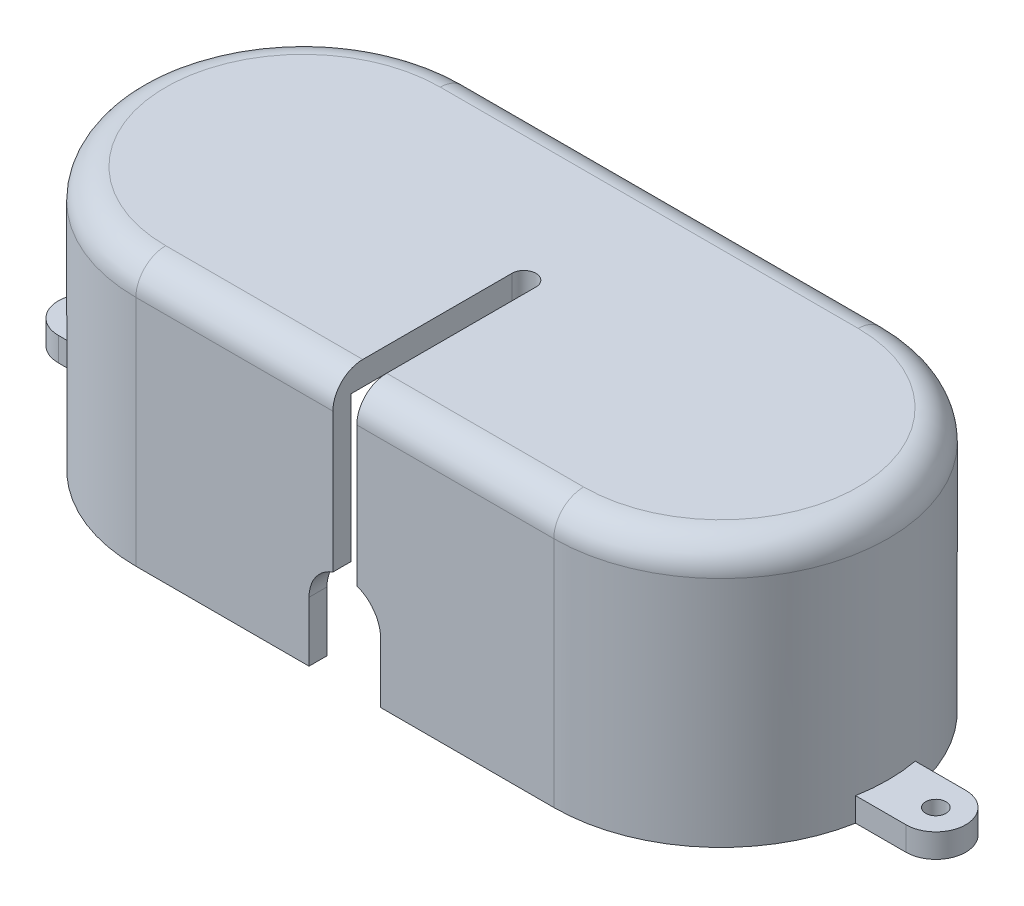
ISO-10303-21;
HEADER;
FILE_DESCRIPTION(('STEP AP214'),'2;1');
FILE_NAME('part.step','',(''),(''),'','','');
FILE_SCHEMA(('AUTOMOTIVE_DESIGN { 1 0 10303 214 1 1 1 1 }'));
ENDSEC;
DATA;
#1=APPLICATION_CONTEXT('core data for automotive mechanical design processes');
#2=APPLICATION_PROTOCOL_DEFINITION('international standard','automotive_design',2000,#1);
#3=PRODUCT_CONTEXT('',#1,'mechanical');
#4=PRODUCT('Part','Part','',(#3));
#5=PRODUCT_RELATED_PRODUCT_CATEGORY('part','',(#4));
#6=PRODUCT_DEFINITION_FORMATION('','',#4);
#7=PRODUCT_DEFINITION_CONTEXT('part definition',#1,'design');
#8=PRODUCT_DEFINITION('design','',#6,#7);
#9=PRODUCT_DEFINITION_SHAPE('','',#8);
#10=(LENGTH_UNIT() NAMED_UNIT(*) SI_UNIT(.MILLI.,.METRE.));
#11=(NAMED_UNIT(*) PLANE_ANGLE_UNIT() SI_UNIT($,.RADIAN.));
#12=(NAMED_UNIT(*) SI_UNIT($,.STERADIAN.) SOLID_ANGLE_UNIT());
#13=UNCERTAINTY_MEASURE_WITH_UNIT(LENGTH_MEASURE(1.E-05),#10,'distance_accuracy_value','');
#14=(GEOMETRIC_REPRESENTATION_CONTEXT(3) GLOBAL_UNCERTAINTY_ASSIGNED_CONTEXT((#13)) GLOBAL_UNIT_ASSIGNED_CONTEXT((#10,
#11,#12)) REPRESENTATION_CONTEXT('',''));
#15=CARTESIAN_POINT('',(0.,0.,0.));
#16=DIRECTION('',(0.,0.,1.));
#17=DIRECTION('',(1.,0.,0.));
#18=AXIS2_PLACEMENT_3D('',#15,#16,#17);
#19=CARTESIAN_POINT('',(-35.,40.,28.));
#20=DIRECTION('',(0.,0.,-1.));
#21=DIRECTION('',(-1.,0.,0.));
#22=AXIS2_PLACEMENT_3D('',#19,#20,#21);
#23=PLANE('',#22);
#24=DIRECTION('',(0.,1.,0.));
#25=VECTOR('',#24,1.);
#26=CARTESIAN_POINT('',(-1.99999999999999,0.,28.));
#27=LINE('',#26,#25);
#28=CARTESIAN_POINT('',(-2.,15.6568542494924,28.));
#29=VERTEX_POINT('',#28);
#30=CARTESIAN_POINT('',(-2.00000000000001,39.,28.));
#31=VERTEX_POINT('',#30);
#32=EDGE_CURVE('E253',#29,#31,#27,.T.);
#33=ORIENTED_EDGE('',*,*,#32,.T.);
#34=DIRECTION('',(-1.,0.,0.));
#35=VECTOR('',#34,1.);
#36=CARTESIAN_POINT('',(-35.,39.,28.));
#37=LINE('',#36,#35);
#38=CARTESIAN_POINT('',(-35.,39.,28.));
#39=VERTEX_POINT('',#38);
#40=EDGE_CURVE('E515',#31,#39,#37,.T.);
#41=ORIENTED_EDGE('',*,*,#40,.T.);
#42=DIRECTION('',(0.,-1.,0.));
#43=VECTOR('',#42,1.);
#44=CARTESIAN_POINT('',(-35.,40.,28.));
#45=LINE('',#44,#43);
#46=CARTESIAN_POINT('',(-35.,0.,28.));
#47=VERTEX_POINT('',#46);
#48=EDGE_CURVE('E505',#39,#47,#45,.T.);
#49=ORIENTED_EDGE('',*,*,#48,.T.);
#50=DIRECTION('',(1.,0.,0.));
#51=VECTOR('',#50,1.);
#52=CARTESIAN_POINT('',(-35.,0.,28.));
#53=LINE('',#52,#51);
#54=CARTESIAN_POINT('',(-6.,0.,28.));
#55=VERTEX_POINT('',#54);
#56=EDGE_CURVE('E484',#47,#55,#53,.T.);
#57=ORIENTED_EDGE('',*,*,#56,.T.);
#58=DIRECTION('',(0.,1.,0.));
#59=VECTOR('',#58,1.);
#60=CARTESIAN_POINT('',(-5.99999999999998,40.,28.));
#61=LINE('',#60,#59);
#62=CARTESIAN_POINT('',(-5.99999999999999,10.,28.));
#63=VERTEX_POINT('',#62);
#64=EDGE_CURVE('E321',#55,#63,#61,.T.);
#65=ORIENTED_EDGE('',*,*,#64,.T.);
#66=CARTESIAN_POINT('',(0.,10.,28.));
#67=DIRECTION('',(0.,0.,-1.));
#68=DIRECTION('',(-1.,0.,0.));
#69=AXIS2_PLACEMENT_3D('',#66,#67,#68);
#70=CIRCLE('',#69,6.);
#71=EDGE_CURVE('E326',#63,#29,#70,.T.);
#72=ORIENTED_EDGE('',*,*,#71,.T.);
#73=EDGE_LOOP('',(#33,#41,#49,#57,#65,#72));
#74=FACE_BOUND('',#73,.T.);
#75=ADVANCED_FACE('F49',(#74),#23,.F.);
#76=CARTESIAN_POINT('',(-35.,40.,25.));
#77=DIRECTION('',(0.,0.,-1.));
#78=DIRECTION('',(-1.,0.,0.));
#79=AXIS2_PLACEMENT_3D('',#76,#77,#78);
#80=PLANE('',#79);
#81=DIRECTION('',(1.,0.,0.));
#82=VECTOR('',#81,1.);
#83=CARTESIAN_POINT('',(-35.,40.,25.));
#84=LINE('',#83,#82);
#85=CARTESIAN_POINT('',(-35.,40.,25.));
#86=VERTEX_POINT('',#85);
#87=CARTESIAN_POINT('',(-2.,40.,25.));
#88=VERTEX_POINT('',#87);
#89=EDGE_CURVE('E437',#86,#88,#84,.T.);
#90=ORIENTED_EDGE('',*,*,#89,.T.);
#91=DIRECTION('',(0.,-1.,0.));
#92=VECTOR('',#91,1.);
#93=CARTESIAN_POINT('',(-2.,40.,25.));
#94=LINE('',#93,#92);
#95=CARTESIAN_POINT('',(-2.,15.6568542494924,25.));
#96=VERTEX_POINT('',#95);
#97=EDGE_CURVE('E283',#88,#96,#94,.T.);
#98=ORIENTED_EDGE('',*,*,#97,.T.);
#99=CARTESIAN_POINT('',(0.,10.,25.));
#100=DIRECTION('',(0.,0.,-1.));
#101=DIRECTION('',(-1.,0.,0.));
#102=AXIS2_PLACEMENT_3D('',#99,#100,#101);
#103=CIRCLE('',#102,6.);
#104=CARTESIAN_POINT('',(-5.99999999999999,10.,25.));
#105=VERTEX_POINT('',#104);
#106=EDGE_CURVE('E292',#105,#96,#103,.T.);
#107=ORIENTED_EDGE('',*,*,#106,.F.);
#108=DIRECTION('',(0.,1.,0.));
#109=VECTOR('',#108,1.);
#110=CARTESIAN_POINT('',(-5.99999999999999,10.,25.));
#111=LINE('',#110,#109);
#112=CARTESIAN_POINT('',(-6.,0.,25.));
#113=VERTEX_POINT('',#112);
#114=EDGE_CURVE('E299',#113,#105,#111,.T.);
#115=ORIENTED_EDGE('',*,*,#114,.F.);
#116=DIRECTION('',(1.,0.,0.));
#117=VECTOR('',#116,1.);
#118=CARTESIAN_POINT('',(-35.,0.,25.));
#119=LINE('',#118,#117);
#120=CARTESIAN_POINT('',(-35.,0.,25.));
#121=VERTEX_POINT('',#120);
#122=EDGE_CURVE('E454',#121,#113,#119,.T.);
#123=ORIENTED_EDGE('',*,*,#122,.F.);
#124=DIRECTION('',(0.,-1.,0.));
#125=VECTOR('',#124,1.);
#126=CARTESIAN_POINT('',(-35.,40.,25.));
#127=LINE('',#126,#125);
#128=EDGE_CURVE('E475',#86,#121,#127,.T.);
#129=ORIENTED_EDGE('',*,*,#128,.F.);
#130=EDGE_LOOP('',(#90,#98,#107,#115,#123,#129));
#131=FACE_BOUND('',#130,.T.);
#132=ADVANCED_FACE('F589',(#131),#80,.T.);
#133=CARTESIAN_POINT('',(-35.,40.,0.));
#134=DIRECTION('',(0.,1.,0.));
#135=DIRECTION('',(0.,0.,1.));
#136=AXIS2_PLACEMENT_3D('',#133,#134,#135);
#137=PLANE('',#136);
#138=DIRECTION('',(0.,0.,-1.));
#139=VECTOR('',#138,1.);
#140=CARTESIAN_POINT('',(2.00000000000002,40.,0.));
#141=LINE('',#140,#139);
#142=CARTESIAN_POINT('',(2.00000000000002,40.,25.));
#143=VERTEX_POINT('',#142);
#144=CARTESIAN_POINT('',(2.00000000000001,40.,-2.));
#145=VERTEX_POINT('',#144);
#146=EDGE_CURVE('E280',#143,#145,#141,.T.);
#147=ORIENTED_EDGE('',*,*,#146,.T.);
#148=CARTESIAN_POINT('',(0.,40.,-2.));
#149=DIRECTION('',(0.,1.,0.));
#150=DIRECTION('',(0.,0.,1.));
#151=AXIS2_PLACEMENT_3D('',#148,#149,#150);
#152=CIRCLE('',#151,2.00000000000001);
#153=CARTESIAN_POINT('',(-2.00000000000001,40.,-2.));
#154=VERTEX_POINT('',#153);
#155=EDGE_CURVE('E247',#145,#154,#152,.T.);
#156=ORIENTED_EDGE('',*,*,#155,.T.);
#157=DIRECTION('',(0.,0.,-1.));
#158=VECTOR('',#157,1.);
#159=CARTESIAN_POINT('',(-2.,40.,0.));
#160=LINE('',#159,#158);
#161=EDGE_CURVE('E287',#88,#154,#160,.T.);
#162=ORIENTED_EDGE('',*,*,#161,.F.);
#163=ORIENTED_EDGE('',*,*,#89,.F.);
#164=CARTESIAN_POINT('',(-35.,40.,0.));
#165=DIRECTION('',(0.,1.,0.));
#166=DIRECTION('',(0.,0.,1.));
#167=AXIS2_PLACEMENT_3D('',#164,#165,#166);
#168=CIRCLE('',#167,25.);
#169=CARTESIAN_POINT('',(-35.,40.,-25.));
#170=VERTEX_POINT('',#169);
#171=EDGE_CURVE('E431',#170,#86,#168,.T.);
#172=ORIENTED_EDGE('',*,*,#171,.F.);
#173=DIRECTION('',(-1.,0.,0.));
#174=VECTOR('',#173,1.);
#175=CARTESIAN_POINT('',(-35.,40.,-25.));
#176=LINE('',#175,#174);
#177=CARTESIAN_POINT('',(35.,40.,-25.));
#178=VERTEX_POINT('',#177);
#179=EDGE_CURVE('E445',#178,#170,#176,.T.);
#180=ORIENTED_EDGE('',*,*,#179,.F.);
#181=CARTESIAN_POINT('',(35.,40.,0.));
#182=DIRECTION('',(0.,1.,0.));
#183=DIRECTION('',(0.,0.,1.));
#184=AXIS2_PLACEMENT_3D('',#181,#182,#183);
#185=CIRCLE('',#184,25.);
#186=CARTESIAN_POINT('',(35.,40.,25.));
#187=VERTEX_POINT('',#186);
#188=EDGE_CURVE('E441',#187,#178,#185,.T.);
#189=ORIENTED_EDGE('',*,*,#188,.F.);
#190=EDGE_CURVE('E435',#143,#187,#84,.T.);
#191=ORIENTED_EDGE('',*,*,#190,.F.);
#192=EDGE_LOOP('',(#147,#156,#162,#163,#172,#180,#189,#191));
#193=FACE_BOUND('',#192,.T.);
#194=ADVANCED_FACE('F582',(#193),#137,.F.);
#195=CARTESIAN_POINT('',(-35.,44.,0.));
#196=DIRECTION('',(0.,1.,0.));
#197=DIRECTION('',(0.,0.,1.));
#198=AXIS2_PLACEMENT_3D('',#195,#196,#197);
#199=PLANE('',#198);
#200=CARTESIAN_POINT('',(-35.,44.,0.));
#201=DIRECTION('',(0.,1.,0.));
#202=DIRECTION('',(0.,0.,1.));
#203=AXIS2_PLACEMENT_3D('',#200,#201,#202);
#204=CIRCLE('',#203,23.);
#205=CARTESIAN_POINT('',(-35.,44.,-23.));
#206=VERTEX_POINT('',#205);
#207=CARTESIAN_POINT('',(-35.,44.,23.));
#208=VERTEX_POINT('',#207);
#209=EDGE_CURVE('E525',#206,#208,#204,.T.);
#210=ORIENTED_EDGE('',*,*,#209,.T.);
#211=DIRECTION('',(-1.,0.,0.));
#212=VECTOR('',#211,1.);
#213=CARTESIAN_POINT('',(-2.00000000000001,44.,23.));
#214=LINE('',#213,#212);
#215=CARTESIAN_POINT('',(-2.00000000000001,44.,23.));
#216=VERTEX_POINT('',#215);
#217=EDGE_CURVE('E531',#208,#216,#214,.F.);
#218=ORIENTED_EDGE('',*,*,#217,.T.);
#219=DIRECTION('',(0.,0.,1.));
#220=VECTOR('',#219,1.);
#221=CARTESIAN_POINT('',(-2.00000000000001,44.,-2.));
#222=LINE('',#221,#220);
#223=CARTESIAN_POINT('',(-2.00000000000001,44.,-2.));
#224=VERTEX_POINT('',#223);
#225=EDGE_CURVE('E262',#224,#216,#222,.T.);
#226=ORIENTED_EDGE('',*,*,#225,.F.);
#227=CARTESIAN_POINT('',(0.,44.,-2.));
#228=DIRECTION('',(0.,1.,0.));
#229=DIRECTION('',(0.,0.,1.));
#230=AXIS2_PLACEMENT_3D('',#227,#228,#229);
#231=CIRCLE('',#230,2.00000000000001);
#232=CARTESIAN_POINT('',(2.00000000000001,44.,-2.));
#233=VERTEX_POINT('',#232);
#234=EDGE_CURVE('E244',#233,#224,#231,.T.);
#235=ORIENTED_EDGE('',*,*,#234,.F.);
#236=DIRECTION('',(0.,0.,1.));
#237=VECTOR('',#236,1.);
#238=CARTESIAN_POINT('',(2.00000000000001,44.,-2.));
#239=LINE('',#238,#237);
#240=CARTESIAN_POINT('',(2.00000000000001,44.,23.));
#241=VERTEX_POINT('',#240);
#242=EDGE_CURVE('E259',#233,#241,#239,.T.);
#243=ORIENTED_EDGE('',*,*,#242,.T.);
#244=DIRECTION('',(-1.,0.,0.));
#245=VECTOR('',#244,1.);
#246=CARTESIAN_POINT('',(35.,44.,23.));
#247=LINE('',#246,#245);
#248=CARTESIAN_POINT('',(35.,44.,23.));
#249=VERTEX_POINT('',#248);
#250=EDGE_CURVE('E528',#241,#249,#247,.F.);
#251=ORIENTED_EDGE('',*,*,#250,.T.);
#252=CARTESIAN_POINT('',(35.,44.,0.));
#253=DIRECTION('',(0.,1.,0.));
#254=DIRECTION('',(0.,0.,1.));
#255=AXIS2_PLACEMENT_3D('',#252,#253,#254);
#256=CIRCLE('',#255,23.);
#257=CARTESIAN_POINT('',(35.,44.,-23.));
#258=VERTEX_POINT('',#257);
#259=EDGE_CURVE('E519',#249,#258,#256,.T.);
#260=ORIENTED_EDGE('',*,*,#259,.T.);
#261=DIRECTION('',(-1.,0.,0.));
#262=VECTOR('',#261,1.);
#263=CARTESIAN_POINT('',(-35.,44.,-23.));
#264=LINE('',#263,#262);
#265=EDGE_CURVE('E522',#258,#206,#264,.T.);
#266=ORIENTED_EDGE('',*,*,#265,.T.);
#267=EDGE_LOOP('',(#210,#218,#226,#235,#243,#251,#260,#266));
#268=FACE_BOUND('',#267,.T.);
#269=ADVANCED_FACE('F258',(#268),#199,.T.);
#270=CARTESIAN_POINT('',(0.,10.,29.));
#271=DIRECTION('',(0.,0.,-1.));
#272=DIRECTION('',(-1.,0.,0.));
#273=AXIS2_PLACEMENT_3D('',#270,#271,#272);
#274=CYLINDRICAL_SURFACE('',#273,6.);
#275=DIRECTION('',(0.,0.,-1.));
#276=VECTOR('',#275,1.);
#277=CARTESIAN_POINT('',(-2.,15.6568542494924,29.));
#278=LINE('',#277,#276);
#279=EDGE_CURVE('E512',#29,#96,#278,.T.);
#280=ORIENTED_EDGE('',*,*,#279,.F.);
#281=ORIENTED_EDGE('',*,*,#71,.F.);
#282=DIRECTION('',(0.,0.,-1.));
#283=VECTOR('',#282,1.);
#284=CARTESIAN_POINT('',(-5.99999999999999,10.,29.));
#285=LINE('',#284,#283);
#286=EDGE_CURVE('E304',#63,#105,#285,.T.);
#287=ORIENTED_EDGE('',*,*,#286,.T.);
#288=ORIENTED_EDGE('',*,*,#106,.T.);
#289=EDGE_LOOP('',(#280,#281,#287,#288));
#290=FACE_BOUND('',#289,.T.);
#291=ADVANCED_FACE('F593',(#290),#274,.F.);
#292=CARTESIAN_POINT('',(-35.,40.,0.));
#293=DIRECTION('',(0.,-1.,0.));
#294=DIRECTION('',(0.,0.,-1.));
#295=AXIS2_PLACEMENT_3D('',#292,#293,#294);
#296=CYLINDRICAL_SURFACE('',#295,28.);
#297=ORIENTED_EDGE('',*,*,#48,.F.);
#298=CARTESIAN_POINT('',(-35.,39.,0.));
#299=DIRECTION('',(0.,1.,0.));
#300=DIRECTION('',(0.,0.,1.));
#301=AXIS2_PLACEMENT_3D('',#298,#299,#300);
#302=CIRCLE('',#301,28.);
#303=CARTESIAN_POINT('',(-35.,39.,-28.));
#304=VERTEX_POINT('',#303);
#305=EDGE_CURVE('E74',#39,#304,#302,.F.);
#306=ORIENTED_EDGE('',*,*,#305,.T.);
#307=DIRECTION('',(0.,-1.,0.));
#308=VECTOR('',#307,1.);
#309=CARTESIAN_POINT('',(-35.,40.,-28.));
#310=LINE('',#309,#308);
#311=CARTESIAN_POINT('',(-35.,0.,-28.));
#312=VERTEX_POINT('',#311);
#313=EDGE_CURVE('E496',#304,#312,#310,.T.);
#314=ORIENTED_EDGE('',*,*,#313,.T.);
#315=CARTESIAN_POINT('',(-35.,0.,0.));
#316=DIRECTION('',(0.,1.,0.));
#317=DIRECTION('',(0.,0.,1.));
#318=AXIS2_PLACEMENT_3D('',#315,#316,#317);
#319=CIRCLE('',#318,28.);
#320=CARTESIAN_POINT('',(-62.5499546279118,0.,-5.));
#321=VERTEX_POINT('',#320);
#322=EDGE_CURVE('E480',#312,#321,#319,.T.);
#323=ORIENTED_EDGE('',*,*,#322,.T.);
#324=DIRECTION('',(0.,-1.,0.));
#325=VECTOR('',#324,1.);
#326=CARTESIAN_POINT('',(-62.5499546279118,4.,-5.));
#327=LINE('',#326,#325);
#328=CARTESIAN_POINT('',(-62.5499546279118,4.,-5.));
#329=VERTEX_POINT('',#328);
#330=EDGE_CURVE('E422',#329,#321,#327,.T.);
#331=ORIENTED_EDGE('',*,*,#330,.F.);
#332=CARTESIAN_POINT('',(-35.,4.,0.));
#333=DIRECTION('',(0.,-1.,0.));
#334=DIRECTION('',(0.,0.,-1.));
#335=AXIS2_PLACEMENT_3D('',#332,#333,#334);
#336=CIRCLE('',#335,28.);
#337=CARTESIAN_POINT('',(-62.5499546279118,4.,5.));
#338=VERTEX_POINT('',#337);
#339=EDGE_CURVE('E398',#338,#329,#336,.T.);
#340=ORIENTED_EDGE('',*,*,#339,.F.);
#341=DIRECTION('',(0.,-1.,0.));
#342=VECTOR('',#341,1.);
#343=CARTESIAN_POINT('',(-62.5499546279118,4.,5.));
#344=LINE('',#343,#342);
#345=CARTESIAN_POINT('',(-62.5499546279118,0.,5.));
#346=VERTEX_POINT('',#345);
#347=EDGE_CURVE('E417',#338,#346,#344,.T.);
#348=ORIENTED_EDGE('',*,*,#347,.T.);
#349=EDGE_CURVE('E479',#346,#47,#319,.T.);
#350=ORIENTED_EDGE('',*,*,#349,.T.);
#351=EDGE_LOOP('',(#297,#306,#314,#323,#331,#340,#348,#350));
#352=FACE_BOUND('',#351,.T.);
#353=ADVANCED_FACE('F636',(#352),#296,.T.);
#354=CARTESIAN_POINT('',(-35.,0.,0.));
#355=DIRECTION('',(0.,1.,0.));
#356=DIRECTION('',(0.,0.,1.));
#357=AXIS2_PLACEMENT_3D('',#354,#355,#356);
#358=PLANE('',#357);
#359=ORIENTED_EDGE('',*,*,#122,.T.);
#360=DIRECTION('',(0.,0.,-1.));
#361=VECTOR('',#360,1.);
#362=CARTESIAN_POINT('',(-6.,0.,29.));
#363=LINE('',#362,#361);
#364=EDGE_CURVE('E308',#55,#113,#363,.T.);
#365=ORIENTED_EDGE('',*,*,#364,.F.);
#366=ORIENTED_EDGE('',*,*,#56,.F.);
#367=ORIENTED_EDGE('',*,*,#349,.F.);
#368=DIRECTION('',(1.,0.,0.));
#369=VECTOR('',#368,1.);
#370=CARTESIAN_POINT('',(0.,0.,5.00000000000001));
#371=LINE('',#370,#369);
#372=CARTESIAN_POINT('',(-71.,0.,5.));
#373=VERTEX_POINT('',#372);
#374=EDGE_CURVE('E406',#373,#346,#371,.T.);
#375=ORIENTED_EDGE('',*,*,#374,.F.);
#376=CARTESIAN_POINT('',(-71.,0.,0.));
#377=DIRECTION('',(0.,-1.,0.));
#378=DIRECTION('',(0.,0.,-1.));
#379=AXIS2_PLACEMENT_3D('',#376,#377,#378);
#380=CIRCLE('',#379,5.);
#381=CARTESIAN_POINT('',(-71.,0.,-5.));
#382=VERTEX_POINT('',#381);
#383=EDGE_CURVE('E410',#373,#382,#380,.T.);
#384=ORIENTED_EDGE('',*,*,#383,.T.);
#385=DIRECTION('',(1.,0.,0.));
#386=VECTOR('',#385,1.);
#387=CARTESIAN_POINT('',(0.,0.,-5.00000000000001));
#388=LINE('',#387,#386);
#389=EDGE_CURVE('E386',#382,#321,#388,.T.);
#390=ORIENTED_EDGE('',*,*,#389,.T.);
#391=ORIENTED_EDGE('',*,*,#322,.F.);
#392=DIRECTION('',(-1.,0.,0.));
#393=VECTOR('',#392,1.);
#394=CARTESIAN_POINT('',(-35.,0.,-28.));
#395=LINE('',#394,#393);
#396=CARTESIAN_POINT('',(35.,0.,-28.));
#397=VERTEX_POINT('',#396);
#398=EDGE_CURVE('E492',#397,#312,#395,.T.);
#399=ORIENTED_EDGE('',*,*,#398,.F.);
#400=CARTESIAN_POINT('',(35.,0.,0.));
#401=DIRECTION('',(0.,1.,0.));
#402=DIRECTION('',(0.,0.,1.));
#403=AXIS2_PLACEMENT_3D('',#400,#401,#402);
#404=CIRCLE('',#403,28.);
#405=CARTESIAN_POINT('',(62.5499546279118,0.,-5.));
#406=VERTEX_POINT('',#405);
#407=EDGE_CURVE('E488',#406,#397,#404,.T.);
#408=ORIENTED_EDGE('',*,*,#407,.F.);
#409=DIRECTION('',(-1.,0.,0.));
#410=VECTOR('',#409,1.);
#411=CARTESIAN_POINT('',(0.,0.,-5.00000000000001));
#412=LINE('',#411,#410);
#413=CARTESIAN_POINT('',(71.,0.,-5.));
#414=VERTEX_POINT('',#413);
#415=EDGE_CURVE('E359',#414,#406,#412,.T.);
#416=ORIENTED_EDGE('',*,*,#415,.F.);
#417=CARTESIAN_POINT('',(71.,0.,0.));
#418=DIRECTION('',(0.,1.,0.));
#419=DIRECTION('',(0.,0.,-1.));
#420=AXIS2_PLACEMENT_3D('',#417,#418,#419);
#421=CIRCLE('',#420,5.);
#422=CARTESIAN_POINT('',(71.,0.,5.));
#423=VERTEX_POINT('',#422);
#424=EDGE_CURVE('E336',#423,#414,#421,.T.);
#425=ORIENTED_EDGE('',*,*,#424,.F.);
#426=DIRECTION('',(-1.,0.,0.));
#427=VECTOR('',#426,1.);
#428=CARTESIAN_POINT('',(0.,0.,5.00000000000001));
#429=LINE('',#428,#427);
#430=CARTESIAN_POINT('',(62.5499546279118,0.,5.));
#431=VERTEX_POINT('',#430);
#432=EDGE_CURVE('E355',#423,#431,#429,.T.);
#433=ORIENTED_EDGE('',*,*,#432,.T.);
#434=CARTESIAN_POINT('',(35.,0.,28.));
#435=VERTEX_POINT('',#434);
#436=EDGE_CURVE('E489',#435,#431,#404,.T.);
#437=ORIENTED_EDGE('',*,*,#436,.F.);
#438=CARTESIAN_POINT('',(6.00000000000001,0.,28.));
#439=VERTEX_POINT('',#438);
#440=EDGE_CURVE('E483',#439,#435,#53,.T.);
#441=ORIENTED_EDGE('',*,*,#440,.F.);
#442=DIRECTION('',(0.,0.,-1.));
#443=VECTOR('',#442,1.);
#444=CARTESIAN_POINT('',(6.00000000000001,0.,29.));
#445=LINE('',#444,#443);
#446=CARTESIAN_POINT('',(6.00000000000001,0.,25.));
#447=VERTEX_POINT('',#446);
#448=EDGE_CURVE('E311',#439,#447,#445,.T.);
#449=ORIENTED_EDGE('',*,*,#448,.T.);
#450=CARTESIAN_POINT('',(35.,0.,25.));
#451=VERTEX_POINT('',#450);
#452=EDGE_CURVE('E453',#447,#451,#119,.T.);
#453=ORIENTED_EDGE('',*,*,#452,.T.);
#454=CARTESIAN_POINT('',(35.,0.,0.));
#455=DIRECTION('',(0.,1.,0.));
#456=DIRECTION('',(0.,0.,1.));
#457=AXIS2_PLACEMENT_3D('',#454,#455,#456);
#458=CIRCLE('',#457,25.);
#459=CARTESIAN_POINT('',(35.,0.,-25.));
#460=VERTEX_POINT('',#459);
#461=EDGE_CURVE('E458',#451,#460,#458,.T.);
#462=ORIENTED_EDGE('',*,*,#461,.T.);
#463=DIRECTION('',(-1.,0.,0.));
#464=VECTOR('',#463,1.);
#465=CARTESIAN_POINT('',(-35.,0.,-25.));
#466=LINE('',#465,#464);
#467=CARTESIAN_POINT('',(-35.,0.,-25.));
#468=VERTEX_POINT('',#467);
#469=EDGE_CURVE('E436',#460,#468,#466,.T.);
#470=ORIENTED_EDGE('',*,*,#469,.T.);
#471=CARTESIAN_POINT('',(-35.,0.,0.));
#472=DIRECTION('',(0.,1.,0.));
#473=DIRECTION('',(0.,0.,1.));
#474=AXIS2_PLACEMENT_3D('',#471,#472,#473);
#475=CIRCLE('',#474,25.);
#476=EDGE_CURVE('E421',#468,#121,#475,.T.);
#477=ORIENTED_EDGE('',*,*,#476,.T.);
#478=EDGE_LOOP('',(#359,#365,#366,#367,#375,#384,#390,#391,#399,#408,#416,#425,#433,#437,#441,
#449,#453,#462,#470,#477));
#479=FACE_BOUND('',#478,.T.);
#480=CARTESIAN_POINT('',(-71.,0.,0.));
#481=DIRECTION('',(0.,-1.,0.));
#482=DIRECTION('',(0.,0.,-1.));
#483=AXIS2_PLACEMENT_3D('',#480,#481,#482);
#484=CIRCLE('',#483,1.7);
#485=CARTESIAN_POINT('',(-71.,0.,-1.7));
#486=VERTEX_POINT('',#485);
#487=EDGE_CURVE('E369',#486,#486,#484,.T.);
#488=ORIENTED_EDGE('',*,*,#487,.F.);
#489=EDGE_LOOP('',(#488));
#490=FACE_BOUND('',#489,.T.);
#491=CARTESIAN_POINT('',(71.,0.,0.));
#492=DIRECTION('',(0.,1.,0.));
#493=DIRECTION('',(0.,0.,-1.));
#494=AXIS2_PLACEMENT_3D('',#491,#492,#493);
#495=CIRCLE('',#494,1.7);
#496=CARTESIAN_POINT('',(71.,0.,-1.7));
#497=VERTEX_POINT('',#496);
#498=EDGE_CURVE('E330',#497,#497,#495,.T.);
#499=ORIENTED_EDGE('',*,*,#498,.T.);
#500=EDGE_LOOP('',(#499));
#501=FACE_BOUND('',#500,.T.);
#502=ADVANCED_FACE('F599',(#479,#490,#501),#358,.F.);
#503=DIRECTION('',(0.,-1.,0.));
#504=VECTOR('',#503,1.);
#505=CARTESIAN_POINT('',(35.,40.,28.));
#506=LINE('',#505,#504);
#507=CARTESIAN_POINT('',(35.,39.,28.));
#508=VERTEX_POINT('',#507);
#509=EDGE_CURVE('E502',#508,#435,#506,.T.);
#510=ORIENTED_EDGE('',*,*,#509,.F.);
#511=DIRECTION('',(-1.,0.,0.));
#512=VECTOR('',#511,1.);
#513=CARTESIAN_POINT('',(2.00000000000002,39.,28.));
#514=LINE('',#513,#512);
#515=CARTESIAN_POINT('',(2.00000000000001,39.,28.));
#516=VERTEX_POINT('',#515);
#517=EDGE_CURVE('E537',#508,#516,#514,.T.);
#518=ORIENTED_EDGE('',*,*,#517,.T.);
#519=DIRECTION('',(0.,1.,0.));
#520=VECTOR('',#519,1.);
#521=CARTESIAN_POINT('',(2.00000000000001,0.,28.));
#522=LINE('',#521,#520);
#523=CARTESIAN_POINT('',(2.00000000000001,15.6568542494924,28.));
#524=VERTEX_POINT('',#523);
#525=EDGE_CURVE('E571',#524,#516,#522,.T.);
#526=ORIENTED_EDGE('',*,*,#525,.F.);
#527=CARTESIAN_POINT('',(6.00000000000001,10.,28.));
#528=VERTEX_POINT('',#527);
#529=EDGE_CURVE('E325',#524,#528,#70,.T.);
#530=ORIENTED_EDGE('',*,*,#529,.T.);
#531=DIRECTION('',(0.,-1.,0.));
#532=VECTOR('',#531,1.);
#533=CARTESIAN_POINT('',(6.00000000000001,40.,28.));
#534=LINE('',#533,#532);
#535=EDGE_CURVE('E307',#528,#439,#534,.T.);
#536=ORIENTED_EDGE('',*,*,#535,.T.);
#537=ORIENTED_EDGE('',*,*,#440,.T.);
#538=EDGE_LOOP('',(#510,#518,#526,#530,#536,#537));
#539=FACE_BOUND('',#538,.T.);
#540=ADVANCED_FACE('F570',(#539),#23,.F.);
#541=CARTESIAN_POINT('',(35.,40.,0.));
#542=DIRECTION('',(0.,-1.,0.));
#543=DIRECTION('',(0.,0.,-1.));
#544=AXIS2_PLACEMENT_3D('',#541,#542,#543);
#545=CYLINDRICAL_SURFACE('',#544,28.);
#546=DIRECTION('',(0.,-1.,0.));
#547=VECTOR('',#546,1.);
#548=CARTESIAN_POINT('',(35.,40.,-28.));
#549=LINE('',#548,#547);
#550=CARTESIAN_POINT('',(35.,39.,-28.));
#551=VERTEX_POINT('',#550);
#552=EDGE_CURVE('E499',#551,#397,#549,.T.);
#553=ORIENTED_EDGE('',*,*,#552,.F.);
#554=CARTESIAN_POINT('',(35.,39.,0.));
#555=DIRECTION('',(0.,1.,0.));
#556=DIRECTION('',(0.,0.,1.));
#557=AXIS2_PLACEMENT_3D('',#554,#555,#556);
#558=CIRCLE('',#557,28.);
#559=EDGE_CURVE('E11',#551,#508,#558,.F.);
#560=ORIENTED_EDGE('',*,*,#559,.T.);
#561=ORIENTED_EDGE('',*,*,#509,.T.);
#562=ORIENTED_EDGE('',*,*,#436,.T.);
#563=DIRECTION('',(0.,-1.,0.));
#564=VECTOR('',#563,1.);
#565=CARTESIAN_POINT('',(62.5499546279118,4.,5.));
#566=LINE('',#565,#564);
#567=CARTESIAN_POINT('',(62.5499546279118,4.,5.));
#568=VERTEX_POINT('',#567);
#569=EDGE_CURVE('E351',#568,#431,#566,.T.);
#570=ORIENTED_EDGE('',*,*,#569,.F.);
#571=CARTESIAN_POINT('',(35.,4.,0.));
#572=DIRECTION('',(0.,1.,0.));
#573=DIRECTION('',(0.,0.,-1.));
#574=AXIS2_PLACEMENT_3D('',#571,#572,#573);
#575=CIRCLE('',#574,28.);
#576=CARTESIAN_POINT('',(62.5499546279118,4.,-5.));
#577=VERTEX_POINT('',#576);
#578=EDGE_CURVE('E340',#568,#577,#575,.T.);
#579=ORIENTED_EDGE('',*,*,#578,.T.);
#580=DIRECTION('',(0.,-1.,0.));
#581=VECTOR('',#580,1.);
#582=CARTESIAN_POINT('',(62.5499546279118,4.,-5.));
#583=LINE('',#582,#581);
#584=EDGE_CURVE('E374',#577,#406,#583,.T.);
#585=ORIENTED_EDGE('',*,*,#584,.T.);
#586=ORIENTED_EDGE('',*,*,#407,.T.);
#587=EDGE_LOOP('',(#553,#560,#561,#562,#570,#579,#585,#586));
#588=FACE_BOUND('',#587,.T.);
#589=ADVANCED_FACE('F669',(#588),#545,.T.);
#590=CARTESIAN_POINT('',(-35.,40.,-28.));
#591=DIRECTION('',(0.,0.,1.));
#592=DIRECTION('',(1.,0.,0.));
#593=AXIS2_PLACEMENT_3D('',#590,#591,#592);
#594=PLANE('',#593);
#595=ORIENTED_EDGE('',*,*,#313,.F.);
#596=DIRECTION('',(-1.,0.,0.));
#597=VECTOR('',#596,1.);
#598=CARTESIAN_POINT('',(35.,39.,-28.));
#599=LINE('',#598,#597);
#600=EDGE_CURVE('E59',#304,#551,#599,.F.);
#601=ORIENTED_EDGE('',*,*,#600,.T.);
#602=ORIENTED_EDGE('',*,*,#552,.T.);
#603=ORIENTED_EDGE('',*,*,#398,.T.);
#604=EDGE_LOOP('',(#595,#601,#602,#603));
#605=FACE_BOUND('',#604,.T.);
#606=ADVANCED_FACE('F674',(#605),#594,.F.);
#607=CARTESIAN_POINT('',(-35.,40.,0.));
#608=DIRECTION('',(0.,-1.,0.));
#609=DIRECTION('',(0.,0.,-1.));
#610=AXIS2_PLACEMENT_3D('',#607,#608,#609);
#611=CYLINDRICAL_SURFACE('',#610,25.);
#612=ORIENTED_EDGE('',*,*,#476,.F.);
#613=DIRECTION('',(0.,-1.,0.));
#614=VECTOR('',#613,1.);
#615=CARTESIAN_POINT('',(-35.,40.,-25.));
#616=LINE('',#615,#614);
#617=EDGE_CURVE('E449',#170,#468,#616,.T.);
#618=ORIENTED_EDGE('',*,*,#617,.F.);
#619=ORIENTED_EDGE('',*,*,#171,.T.);
#620=ORIENTED_EDGE('',*,*,#128,.T.);
#621=EDGE_LOOP('',(#612,#618,#619,#620));
#622=FACE_BOUND('',#621,.T.);
#623=ADVANCED_FACE('F605',(#622),#611,.F.);
#624=DIRECTION('',(0.,-1.,0.));
#625=VECTOR('',#624,1.);
#626=CARTESIAN_POINT('',(2.00000000000002,40.,25.));
#627=LINE('',#626,#625);
#628=CARTESIAN_POINT('',(2.00000000000001,15.6568542494924,25.));
#629=VERTEX_POINT('',#628);
#630=EDGE_CURVE('E273',#143,#629,#627,.T.);
#631=ORIENTED_EDGE('',*,*,#630,.F.);
#632=ORIENTED_EDGE('',*,*,#190,.T.);
#633=DIRECTION('',(0.,-1.,0.));
#634=VECTOR('',#633,1.);
#635=CARTESIAN_POINT('',(35.,40.,25.));
#636=LINE('',#635,#634);
#637=EDGE_CURVE('E471',#187,#451,#636,.T.);
#638=ORIENTED_EDGE('',*,*,#637,.T.);
#639=ORIENTED_EDGE('',*,*,#452,.F.);
#640=DIRECTION('',(0.,-1.,0.));
#641=VECTOR('',#640,1.);
#642=CARTESIAN_POINT('',(6.00000000000001,10.,25.));
#643=LINE('',#642,#641);
#644=CARTESIAN_POINT('',(6.00000000000001,10.,25.));
#645=VERTEX_POINT('',#644);
#646=EDGE_CURVE('E296',#645,#447,#643,.T.);
#647=ORIENTED_EDGE('',*,*,#646,.F.);
#648=EDGE_CURVE('E291',#629,#645,#103,.T.);
#649=ORIENTED_EDGE('',*,*,#648,.F.);
#650=EDGE_LOOP('',(#631,#632,#638,#639,#647,#649));
#651=FACE_BOUND('',#650,.T.);
#652=ADVANCED_FACE('F617',(#651),#80,.T.);
#653=CARTESIAN_POINT('',(35.,40.,0.));
#654=DIRECTION('',(0.,-1.,0.));
#655=DIRECTION('',(0.,0.,-1.));
#656=AXIS2_PLACEMENT_3D('',#653,#654,#655);
#657=CYLINDRICAL_SURFACE('',#656,25.);
#658=ORIENTED_EDGE('',*,*,#461,.F.);
#659=ORIENTED_EDGE('',*,*,#637,.F.);
#660=ORIENTED_EDGE('',*,*,#188,.T.);
#661=DIRECTION('',(0.,-1.,0.));
#662=VECTOR('',#661,1.);
#663=CARTESIAN_POINT('',(35.,40.,-25.));
#664=LINE('',#663,#662);
#665=EDGE_CURVE('E468',#178,#460,#664,.T.);
#666=ORIENTED_EDGE('',*,*,#665,.T.);
#667=EDGE_LOOP('',(#658,#659,#660,#666));
#668=FACE_BOUND('',#667,.T.);
#669=ADVANCED_FACE('F613',(#668),#657,.F.);
#670=CARTESIAN_POINT('',(-35.,40.,-25.));
#671=DIRECTION('',(0.,0.,1.));
#672=DIRECTION('',(1.,0.,0.));
#673=AXIS2_PLACEMENT_3D('',#670,#671,#672);
#674=PLANE('',#673);
#675=ORIENTED_EDGE('',*,*,#469,.F.);
#676=ORIENTED_EDGE('',*,*,#665,.F.);
#677=ORIENTED_EDGE('',*,*,#179,.T.);
#678=ORIENTED_EDGE('',*,*,#617,.T.);
#679=EDGE_LOOP('',(#675,#676,#677,#678));
#680=FACE_BOUND('',#679,.T.);
#681=ADVANCED_FACE('F607',(#680),#674,.T.);
#682=CARTESIAN_POINT('',(0.,4.,5.00000000000001));
#683=DIRECTION('',(0.,0.,-1.));
#684=DIRECTION('',(-1.,0.,0.));
#685=AXIS2_PLACEMENT_3D('',#682,#683,#684);
#686=PLANE('',#685);
#687=ORIENTED_EDGE('',*,*,#374,.T.);
#688=ORIENTED_EDGE('',*,*,#347,.F.);
#689=DIRECTION('',(1.,0.,0.));
#690=VECTOR('',#689,1.);
#691=CARTESIAN_POINT('',(0.,4.,5.00000000000001));
#692=LINE('',#691,#690);
#693=CARTESIAN_POINT('',(-71.,4.,5.));
#694=VERTEX_POINT('',#693);
#695=EDGE_CURVE('E385',#694,#338,#692,.T.);
#696=ORIENTED_EDGE('',*,*,#695,.F.);
#697=DIRECTION('',(0.,-1.,0.));
#698=VECTOR('',#697,1.);
#699=CARTESIAN_POINT('',(-71.,4.,5.));
#700=LINE('',#699,#698);
#701=EDGE_CURVE('E402',#694,#373,#700,.T.);
#702=ORIENTED_EDGE('',*,*,#701,.T.);
#703=EDGE_LOOP('',(#687,#688,#696,#702));
#704=FACE_BOUND('',#703,.T.);
#705=ADVANCED_FACE('F703',(#704),#686,.F.);
#706=CARTESIAN_POINT('',(0.,4.,-5.00000000000001));
#707=DIRECTION('',(0.,0.,-1.));
#708=DIRECTION('',(-1.,0.,0.));
#709=AXIS2_PLACEMENT_3D('',#706,#707,#708);
#710=PLANE('',#709);
#711=ORIENTED_EDGE('',*,*,#389,.F.);
#712=DIRECTION('',(0.,-1.,0.));
#713=VECTOR('',#712,1.);
#714=CARTESIAN_POINT('',(-71.,4.,-5.));
#715=LINE('',#714,#713);
#716=CARTESIAN_POINT('',(-71.,4.,-5.));
#717=VERTEX_POINT('',#716);
#718=EDGE_CURVE('E426',#717,#382,#715,.T.);
#719=ORIENTED_EDGE('',*,*,#718,.F.);
#720=DIRECTION('',(1.,0.,0.));
#721=VECTOR('',#720,1.);
#722=CARTESIAN_POINT('',(0.,4.,-5.00000000000001));
#723=LINE('',#722,#721);
#724=EDGE_CURVE('E394',#717,#329,#723,.T.);
#725=ORIENTED_EDGE('',*,*,#724,.T.);
#726=ORIENTED_EDGE('',*,*,#330,.T.);
#727=EDGE_LOOP('',(#711,#719,#725,#726));
#728=FACE_BOUND('',#727,.T.);
#729=ADVANCED_FACE('F693',(#728),#710,.T.);
#730=CARTESIAN_POINT('',(-71.,4.,0.));
#731=DIRECTION('',(0.,-1.,0.));
#732=DIRECTION('',(0.,0.,-1.));
#733=AXIS2_PLACEMENT_3D('',#730,#731,#732);
#734=CYLINDRICAL_SURFACE('',#733,1.7);
#735=CARTESIAN_POINT('',(-71.,4.,0.));
#736=DIRECTION('',(0.,-1.,0.));
#737=DIRECTION('',(0.,0.,-1.));
#738=AXIS2_PLACEMENT_3D('',#735,#736,#737);
#739=CIRCLE('',#738,1.7);
#740=CARTESIAN_POINT('',(-71.,4.,-1.7));
#741=VERTEX_POINT('',#740);
#742=EDGE_CURVE('E381',#741,#741,#739,.T.);
#743=ORIENTED_EDGE('',*,*,#742,.F.);
#744=EDGE_LOOP('',(#743));
#745=FACE_BOUND('',#744,.T.);
#746=ORIENTED_EDGE('',*,*,#487,.T.);
#747=EDGE_LOOP('',(#746));
#748=FACE_BOUND('',#747,.T.);
#749=ADVANCED_FACE('F710',(#745,#748),#734,.F.);
#750=CARTESIAN_POINT('',(-71.,4.,0.));
#751=DIRECTION('',(0.,-1.,0.));
#752=DIRECTION('',(0.,0.,-1.));
#753=AXIS2_PLACEMENT_3D('',#750,#751,#752);
#754=CYLINDRICAL_SURFACE('',#753,5.);
#755=ORIENTED_EDGE('',*,*,#383,.F.);
#756=ORIENTED_EDGE('',*,*,#701,.F.);
#757=CARTESIAN_POINT('',(-71.,4.,0.));
#758=DIRECTION('',(0.,-1.,0.));
#759=DIRECTION('',(0.,0.,-1.));
#760=AXIS2_PLACEMENT_3D('',#757,#758,#759);
#761=CIRCLE('',#760,5.);
#762=EDGE_CURVE('E390',#694,#717,#761,.T.);
#763=ORIENTED_EDGE('',*,*,#762,.T.);
#764=ORIENTED_EDGE('',*,*,#718,.T.);
#765=EDGE_LOOP('',(#755,#756,#763,#764));
#766=FACE_BOUND('',#765,.T.);
#767=ADVANCED_FACE('F697',(#766),#754,.T.);
#768=CARTESIAN_POINT('',(0.,4.,0.));
#769=DIRECTION('',(0.,-1.,0.));
#770=DIRECTION('',(0.,0.,-1.));
#771=AXIS2_PLACEMENT_3D('',#768,#769,#770);
#772=PLANE('',#771);
#773=ORIENTED_EDGE('',*,*,#742,.T.);
#774=EDGE_LOOP('',(#773));
#775=FACE_BOUND('',#774,.T.);
#776=ORIENTED_EDGE('',*,*,#695,.T.);
#777=ORIENTED_EDGE('',*,*,#339,.T.);
#778=ORIENTED_EDGE('',*,*,#724,.F.);
#779=ORIENTED_EDGE('',*,*,#762,.F.);
#780=EDGE_LOOP('',(#776,#777,#778,#779));
#781=FACE_BOUND('',#780,.T.);
#782=ADVANCED_FACE('F701',(#775,#781),#772,.F.);
#783=CARTESIAN_POINT('',(0.,4.,5.00000000000001));
#784=DIRECTION('',(0.,0.,1.));
#785=DIRECTION('',(1.,0.,0.));
#786=AXIS2_PLACEMENT_3D('',#783,#784,#785);
#787=PLANE('',#786);
#788=ORIENTED_EDGE('',*,*,#432,.F.);
#789=DIRECTION('',(0.,-1.,0.));
#790=VECTOR('',#789,1.);
#791=CARTESIAN_POINT('',(71.,4.,5.));
#792=LINE('',#791,#790);
#793=CARTESIAN_POINT('',(71.,4.,5.));
#794=VERTEX_POINT('',#793);
#795=EDGE_CURVE('E366',#794,#423,#792,.T.);
#796=ORIENTED_EDGE('',*,*,#795,.F.);
#797=DIRECTION('',(-1.,0.,0.));
#798=VECTOR('',#797,1.);
#799=CARTESIAN_POINT('',(0.,4.,5.00000000000001));
#800=LINE('',#799,#798);
#801=EDGE_CURVE('E335',#794,#568,#800,.T.);
#802=ORIENTED_EDGE('',*,*,#801,.T.);
#803=ORIENTED_EDGE('',*,*,#569,.T.);
#804=EDGE_LOOP('',(#788,#796,#802,#803));
#805=FACE_BOUND('',#804,.T.);
#806=ADVANCED_FACE('F868',(#805),#787,.T.);
#807=CARTESIAN_POINT('',(71.,4.,0.));
#808=DIRECTION('',(0.,-1.,0.));
#809=DIRECTION('',(0.,0.,-1.));
#810=AXIS2_PLACEMENT_3D('',#807,#808,#809);
#811=CYLINDRICAL_SURFACE('',#810,5.);
#812=ORIENTED_EDGE('',*,*,#424,.T.);
#813=DIRECTION('',(0.,-1.,0.));
#814=VECTOR('',#813,1.);
#815=CARTESIAN_POINT('',(71.,4.,-5.));
#816=LINE('',#815,#814);
#817=CARTESIAN_POINT('',(71.,4.,-5.));
#818=VERTEX_POINT('',#817);
#819=EDGE_CURVE('E370',#818,#414,#816,.T.);
#820=ORIENTED_EDGE('',*,*,#819,.F.);
#821=CARTESIAN_POINT('',(71.,4.,0.));
#822=DIRECTION('',(0.,1.,0.));
#823=DIRECTION('',(0.,0.,-1.));
#824=AXIS2_PLACEMENT_3D('',#821,#822,#823);
#825=CIRCLE('',#824,5.);
#826=EDGE_CURVE('E347',#794,#818,#825,.T.);
#827=ORIENTED_EDGE('',*,*,#826,.F.);
#828=ORIENTED_EDGE('',*,*,#795,.T.);
#829=EDGE_LOOP('',(#812,#820,#827,#828));
#830=FACE_BOUND('',#829,.T.);
#831=ADVANCED_FACE('F859',(#830),#811,.T.);
#832=CARTESIAN_POINT('',(0.,4.,-5.00000000000001));
#833=DIRECTION('',(0.,0.,1.));
#834=DIRECTION('',(1.,0.,0.));
#835=AXIS2_PLACEMENT_3D('',#832,#833,#834);
#836=PLANE('',#835);
#837=ORIENTED_EDGE('',*,*,#415,.T.);
#838=ORIENTED_EDGE('',*,*,#584,.F.);
#839=DIRECTION('',(-1.,0.,0.));
#840=VECTOR('',#839,1.);
#841=CARTESIAN_POINT('',(0.,4.,-5.00000000000001));
#842=LINE('',#841,#840);
#843=EDGE_CURVE('E343',#818,#577,#842,.T.);
#844=ORIENTED_EDGE('',*,*,#843,.F.);
#845=ORIENTED_EDGE('',*,*,#819,.T.);
#846=EDGE_LOOP('',(#837,#838,#844,#845));
#847=FACE_BOUND('',#846,.T.);
#848=ADVANCED_FACE('F850',(#847),#836,.F.);
#849=CARTESIAN_POINT('',(71.,4.,0.));
#850=DIRECTION('',(0.,-1.,0.));
#851=DIRECTION('',(0.,0.,-1.));
#852=AXIS2_PLACEMENT_3D('',#849,#850,#851);
#853=CYLINDRICAL_SURFACE('',#852,1.7);
#854=CARTESIAN_POINT('',(71.,4.,0.));
#855=DIRECTION('',(0.,1.,0.));
#856=DIRECTION('',(0.,0.,-1.));
#857=AXIS2_PLACEMENT_3D('',#854,#855,#856);
#858=CIRCLE('',#857,1.7);
#859=CARTESIAN_POINT('',(71.,4.,-1.7));
#860=VERTEX_POINT('',#859);
#861=EDGE_CURVE('E331',#860,#860,#858,.T.);
#862=ORIENTED_EDGE('',*,*,#861,.T.);
#863=EDGE_LOOP('',(#862));
#864=FACE_BOUND('',#863,.T.);
#865=ORIENTED_EDGE('',*,*,#498,.F.);
#866=EDGE_LOOP('',(#865));
#867=FACE_BOUND('',#866,.T.);
#868=ADVANCED_FACE('F841',(#864,#867),#853,.F.);
#869=CARTESIAN_POINT('',(0.,4.,0.));
#870=DIRECTION('',(0.,-1.,0.));
#871=DIRECTION('',(0.,0.,-1.));
#872=AXIS2_PLACEMENT_3D('',#869,#870,#871);
#873=PLANE('',#872);
#874=ORIENTED_EDGE('',*,*,#861,.F.);
#875=EDGE_LOOP('',(#874));
#876=FACE_BOUND('',#875,.T.);
#877=ORIENTED_EDGE('',*,*,#801,.F.);
#878=ORIENTED_EDGE('',*,*,#826,.T.);
#879=ORIENTED_EDGE('',*,*,#843,.T.);
#880=ORIENTED_EDGE('',*,*,#578,.F.);
#881=EDGE_LOOP('',(#877,#878,#879,#880));
#882=FACE_BOUND('',#881,.T.);
#883=ADVANCED_FACE('F736',(#876,#882),#873,.F.);
#884=ORIENTED_EDGE('',*,*,#529,.F.);
#885=DIRECTION('',(0.,0.,-1.));
#886=VECTOR('',#885,1.);
#887=CARTESIAN_POINT('',(2.00000000000001,15.6568542494924,29.));
#888=LINE('',#887,#886);
#889=EDGE_CURVE('E508',#524,#629,#888,.T.);
#890=ORIENTED_EDGE('',*,*,#889,.T.);
#891=ORIENTED_EDGE('',*,*,#648,.T.);
#892=DIRECTION('',(0.,0.,-1.));
#893=VECTOR('',#892,1.);
#894=CARTESIAN_POINT('',(6.00000000000001,10.,29.));
#895=LINE('',#894,#893);
#896=EDGE_CURVE('E303',#528,#645,#895,.T.);
#897=ORIENTED_EDGE('',*,*,#896,.F.);
#898=EDGE_LOOP('',(#884,#890,#891,#897));
#899=FACE_BOUND('',#898,.T.);
#900=ADVANCED_FACE('F626',(#899),#274,.F.);
#901=CARTESIAN_POINT('',(-5.99999999999999,10.,29.));
#902=DIRECTION('',(-1.,0.,0.));
#903=DIRECTION('',(0.,-1.,0.));
#904=AXIS2_PLACEMENT_3D('',#901,#902,#903);
#905=PLANE('',#904);
#906=ORIENTED_EDGE('',*,*,#364,.T.);
#907=ORIENTED_EDGE('',*,*,#114,.T.);
#908=ORIENTED_EDGE('',*,*,#286,.F.);
#909=ORIENTED_EDGE('',*,*,#64,.F.);
#910=EDGE_LOOP('',(#906,#907,#908,#909));
#911=FACE_BOUND('',#910,.T.);
#912=ADVANCED_FACE('F596',(#911),#905,.F.);
#913=CARTESIAN_POINT('',(6.00000000000001,10.,29.));
#914=DIRECTION('',(1.,0.,0.));
#915=DIRECTION('',(0.,0.,-1.));
#916=AXIS2_PLACEMENT_3D('',#913,#914,#915);
#917=PLANE('',#916);
#918=ORIENTED_EDGE('',*,*,#896,.T.);
#919=ORIENTED_EDGE('',*,*,#646,.T.);
#920=ORIENTED_EDGE('',*,*,#448,.F.);
#921=ORIENTED_EDGE('',*,*,#535,.F.);
#922=EDGE_LOOP('',(#918,#919,#920,#921));
#923=FACE_BOUND('',#922,.T.);
#924=ADVANCED_FACE('F629',(#923),#917,.F.);
#925=CARTESIAN_POINT('',(-1.99999999999999,0.,-2.));
#926=DIRECTION('',(1.,0.,0.));
#927=DIRECTION('',(0.,1.,0.));
#928=AXIS2_PLACEMENT_3D('',#925,#926,#927);
#929=PLANE('',#928);
#930=ORIENTED_EDGE('',*,*,#225,.T.);
#931=CARTESIAN_POINT('',(-2.,39.,23.));
#932=DIRECTION('',(1.,0.,0.));
#933=DIRECTION('',(0.,1.,0.));
#934=AXIS2_PLACEMENT_3D('',#931,#932,#933);
#935=CIRCLE('',#934,5.);
#936=EDGE_CURVE('E534',#216,#31,#935,.T.);
#937=ORIENTED_EDGE('',*,*,#936,.T.);
#938=ORIENTED_EDGE('',*,*,#32,.F.);
#939=ORIENTED_EDGE('',*,*,#279,.T.);
#940=ORIENTED_EDGE('',*,*,#97,.F.);
#941=ORIENTED_EDGE('',*,*,#161,.T.);
#942=DIRECTION('',(0.,1.,0.));
#943=VECTOR('',#942,1.);
#944=CARTESIAN_POINT('',(-1.99999999999999,0.,-2.));
#945=LINE('',#944,#943);
#946=EDGE_CURVE('E252',#154,#224,#945,.T.);
#947=ORIENTED_EDGE('',*,*,#946,.T.);
#948=EDGE_LOOP('',(#930,#937,#938,#939,#940,#941,#947));
#949=FACE_BOUND('',#948,.T.);
#950=ADVANCED_FACE('F585',(#949),#929,.T.);
#951=CARTESIAN_POINT('',(2.00000000000001,0.,-2.));
#952=DIRECTION('',(1.,0.,0.));
#953=DIRECTION('',(0.,0.,-1.));
#954=AXIS2_PLACEMENT_3D('',#951,#952,#953);
#955=PLANE('',#954);
#956=ORIENTED_EDGE('',*,*,#525,.T.);
#957=CARTESIAN_POINT('',(2.00000000000002,39.,23.));
#958=DIRECTION('',(1.,0.,0.));
#959=DIRECTION('',(0.,0.,-1.));
#960=AXIS2_PLACEMENT_3D('',#957,#958,#959);
#961=CIRCLE('',#960,5.);
#962=EDGE_CURVE('E268',#516,#241,#961,.F.);
#963=ORIENTED_EDGE('',*,*,#962,.T.);
#964=ORIENTED_EDGE('',*,*,#242,.F.);
#965=DIRECTION('',(0.,1.,0.));
#966=VECTOR('',#965,1.);
#967=CARTESIAN_POINT('',(2.00000000000001,0.,-2.));
#968=LINE('',#967,#966);
#969=EDGE_CURVE('E241',#145,#233,#968,.T.);
#970=ORIENTED_EDGE('',*,*,#969,.F.);
#971=ORIENTED_EDGE('',*,*,#146,.F.);
#972=ORIENTED_EDGE('',*,*,#630,.T.);
#973=ORIENTED_EDGE('',*,*,#889,.F.);
#974=EDGE_LOOP('',(#956,#963,#964,#970,#971,#972,#973));
#975=FACE_BOUND('',#974,.T.);
#976=ADVANCED_FACE('F266',(#975),#955,.F.);
#977=CARTESIAN_POINT('',(0.,0.,-2.));
#978=DIRECTION('',(0.,1.,0.));
#979=DIRECTION('',(0.,0.,1.));
#980=AXIS2_PLACEMENT_3D('',#977,#978,#979);
#981=CYLINDRICAL_SURFACE('',#980,2.00000000000001);
#982=ORIENTED_EDGE('',*,*,#155,.F.);
#983=ORIENTED_EDGE('',*,*,#969,.T.);
#984=ORIENTED_EDGE('',*,*,#234,.T.);
#985=ORIENTED_EDGE('',*,*,#946,.F.);
#986=EDGE_LOOP('',(#982,#983,#984,#985));
#987=FACE_BOUND('',#986,.T.);
#988=ADVANCED_FACE('F243',(#987),#981,.F.);
#989=CARTESIAN_POINT('',(-35.,39.,23.));
#990=DIRECTION('',(1.,0.,0.));
#991=DIRECTION('',(0.,0.,-1.));
#992=AXIS2_PLACEMENT_3D('',#989,#990,#991);
#993=CYLINDRICAL_SURFACE('',#992,5.);
#994=ORIENTED_EDGE('',*,*,#962,.F.);
#995=ORIENTED_EDGE('',*,*,#517,.F.);
#996=CARTESIAN_POINT('',(35.,39.,23.));
#997=DIRECTION('',(1.,0.,0.));
#998=DIRECTION('',(0.,0.,-1.));
#999=AXIS2_PLACEMENT_3D('',#996,#997,#998);
#1000=CIRCLE('',#999,5.);
#1001=EDGE_CURVE('E53',#249,#508,#1000,.T.);
#1002=ORIENTED_EDGE('',*,*,#1001,.F.);
#1003=ORIENTED_EDGE('',*,*,#250,.F.);
#1004=EDGE_LOOP('',(#994,#995,#1002,#1003));
#1005=FACE_BOUND('',#1004,.T.);
#1006=ADVANCED_FACE('F51',(#1005),#993,.T.);
#1007=CARTESIAN_POINT('',(35.,39.,0.));
#1008=DIRECTION('',(0.,1.,0.));
#1009=DIRECTION('',(0.,0.,1.));
#1010=AXIS2_PLACEMENT_3D('',#1007,#1008,#1009);
#1011=TOROIDAL_SURFACE('',#1010,23.,5.);
#1012=ORIENTED_EDGE('',*,*,#1001,.T.);
#1013=ORIENTED_EDGE('',*,*,#559,.F.);
#1014=CARTESIAN_POINT('',(35.,39.,-23.));
#1015=DIRECTION('',(-1.,0.,0.));
#1016=DIRECTION('',(0.,0.,1.));
#1017=AXIS2_PLACEMENT_3D('',#1014,#1015,#1016);
#1018=CIRCLE('',#1017,5.);
#1019=EDGE_CURVE('E552',#258,#551,#1018,.T.);
#1020=ORIENTED_EDGE('',*,*,#1019,.F.);
#1021=ORIENTED_EDGE('',*,*,#259,.F.);
#1022=EDGE_LOOP('',(#1012,#1013,#1020,#1021));
#1023=FACE_BOUND('',#1022,.T.);
#1024=ADVANCED_FACE('F564',(#1023),#1011,.T.);
#1025=CARTESIAN_POINT('',(-35.,39.,-23.));
#1026=DIRECTION('',(1.,0.,0.));
#1027=DIRECTION('',(0.,0.,-1.));
#1028=AXIS2_PLACEMENT_3D('',#1025,#1026,#1027);
#1029=CYLINDRICAL_SURFACE('',#1028,5.);
#1030=ORIENTED_EDGE('',*,*,#1019,.T.);
#1031=ORIENTED_EDGE('',*,*,#600,.F.);
#1032=CARTESIAN_POINT('',(-35.,39.,-23.));
#1033=DIRECTION('',(-1.,0.,0.));
#1034=DIRECTION('',(0.,0.,1.));
#1035=AXIS2_PLACEMENT_3D('',#1032,#1033,#1034);
#1036=CIRCLE('',#1035,5.);
#1037=EDGE_CURVE('E549',#206,#304,#1036,.T.);
#1038=ORIENTED_EDGE('',*,*,#1037,.F.);
#1039=ORIENTED_EDGE('',*,*,#265,.F.);
#1040=EDGE_LOOP('',(#1030,#1031,#1038,#1039));
#1041=FACE_BOUND('',#1040,.T.);
#1042=ADVANCED_FACE('F650',(#1041),#1029,.T.);
#1043=CARTESIAN_POINT('',(-35.,39.,0.));
#1044=DIRECTION('',(0.,1.,0.));
#1045=DIRECTION('',(0.,0.,1.));
#1046=AXIS2_PLACEMENT_3D('',#1043,#1044,#1045);
#1047=TOROIDAL_SURFACE('',#1046,23.,5.);
#1048=ORIENTED_EDGE('',*,*,#1037,.T.);
#1049=ORIENTED_EDGE('',*,*,#305,.F.);
#1050=CARTESIAN_POINT('',(-35.,39.,23.));
#1051=DIRECTION('',(1.,0.,0.));
#1052=DIRECTION('',(0.,0.,-1.));
#1053=AXIS2_PLACEMENT_3D('',#1050,#1051,#1052);
#1054=CIRCLE('',#1053,5.);
#1055=EDGE_CURVE('E546',#208,#39,#1054,.T.);
#1056=ORIENTED_EDGE('',*,*,#1055,.F.);
#1057=ORIENTED_EDGE('',*,*,#209,.F.);
#1058=EDGE_LOOP('',(#1048,#1049,#1056,#1057));
#1059=FACE_BOUND('',#1058,.T.);
#1060=ADVANCED_FACE('F648',(#1059),#1047,.T.);
#1061=CARTESIAN_POINT('',(-35.,39.,23.));
#1062=DIRECTION('',(1.,0.,0.));
#1063=DIRECTION('',(0.,0.,-1.));
#1064=AXIS2_PLACEMENT_3D('',#1061,#1062,#1063);
#1065=CYLINDRICAL_SURFACE('',#1064,5.);
#1066=ORIENTED_EDGE('',*,*,#936,.F.);
#1067=ORIENTED_EDGE('',*,*,#217,.F.);
#1068=ORIENTED_EDGE('',*,*,#1055,.T.);
#1069=ORIENTED_EDGE('',*,*,#40,.F.);
#1070=EDGE_LOOP('',(#1066,#1067,#1068,#1069));
#1071=FACE_BOUND('',#1070,.T.);
#1072=ADVANCED_FACE('F643',(#1071),#1065,.T.);
#1073=CLOSED_SHELL('',(#75,#132,#194,#269,#291,#353,#502,#540,#589,#606,#623,#652,#669,#681,
#705,#729,#749,#767,#782,#806,#831,#848,#868,#883,#900,#912,#924,#950,#976,#988,#1006,#1024,
#1042,#1060,#1072));
#1074=MANIFOLD_SOLID_BREP('B2',#1073);
#1075=ADVANCED_BREP_SHAPE_REPRESENTATION('',(#18,#1074),#14);
#1076=SHAPE_DEFINITION_REPRESENTATION(#9,#1075);
ENDSEC;
END-ISO-10303-21;
